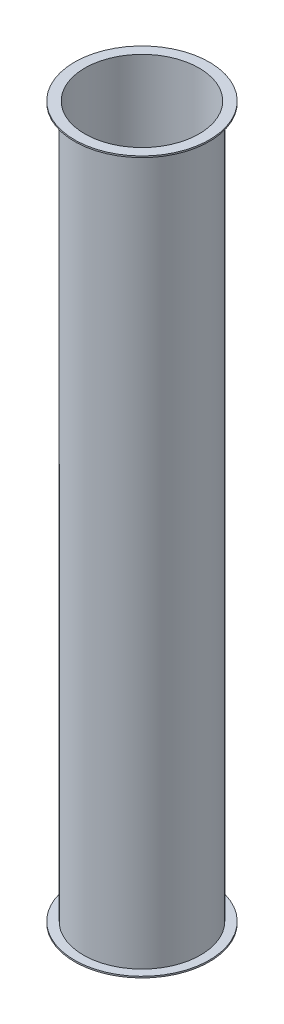
ISO-10303-21;
HEADER;
FILE_DESCRIPTION(('STEP AP214'),'2;1');
FILE_NAME('part.step','',(''),(''),'','','');
FILE_SCHEMA(('AUTOMOTIVE_DESIGN { 1 0 10303 214 1 1 1 1 }'));
ENDSEC;
DATA;
#1=APPLICATION_CONTEXT('core data for automotive mechanical design processes');
#2=APPLICATION_PROTOCOL_DEFINITION('international standard','automotive_design',2000,#1);
#3=PRODUCT_CONTEXT('',#1,'mechanical');
#4=PRODUCT('Part','Part','',(#3));
#5=PRODUCT_RELATED_PRODUCT_CATEGORY('part','',(#4));
#6=PRODUCT_DEFINITION_FORMATION('','',#4);
#7=PRODUCT_DEFINITION_CONTEXT('part definition',#1,'design');
#8=PRODUCT_DEFINITION('design','',#6,#7);
#9=PRODUCT_DEFINITION_SHAPE('','',#8);
#10=(LENGTH_UNIT() NAMED_UNIT(*) SI_UNIT(.MILLI.,.METRE.));
#11=(NAMED_UNIT(*) PLANE_ANGLE_UNIT() SI_UNIT($,.RADIAN.));
#12=(NAMED_UNIT(*) SI_UNIT($,.STERADIAN.) SOLID_ANGLE_UNIT());
#13=UNCERTAINTY_MEASURE_WITH_UNIT(LENGTH_MEASURE(1.E-05),#10,'distance_accuracy_value','');
#14=(GEOMETRIC_REPRESENTATION_CONTEXT(3) GLOBAL_UNCERTAINTY_ASSIGNED_CONTEXT((#13)) GLOBAL_UNIT_ASSIGNED_CONTEXT((#10,
#11,#12)) REPRESENTATION_CONTEXT('',''));
#15=CARTESIAN_POINT('',(0.,0.,0.));
#16=DIRECTION('',(0.,0.,1.));
#17=DIRECTION('',(1.,0.,0.));
#18=AXIS2_PLACEMENT_3D('',#15,#16,#17);
#19=CARTESIAN_POINT('',(-42.5,486.,0.));
#20=DIRECTION('',(0.,1.,0.));
#21=DIRECTION('',(1.,0.,0.));
#22=AXIS2_PLACEMENT_3D('',#19,#20,#21);
#23=PLANE('',#22);
#24=CARTESIAN_POINT('',(0.,486.,0.));
#25=DIRECTION('',(0.,1.,0.));
#26=DIRECTION('',(-1.,0.,0.));
#27=AXIS2_PLACEMENT_3D('',#24,#25,#26);
#28=CIRCLE('',#27,39.);
#29=CARTESIAN_POINT('',(-39.,486.,0.));
#30=VERTEX_POINT('',#29);
#31=EDGE_CURVE('E79',#30,#30,#28,.T.);
#32=ORIENTED_EDGE('',*,*,#31,.F.);
#33=EDGE_LOOP('',(#32));
#34=FACE_BOUND('',#33,.T.);
#35=CARTESIAN_POINT('',(0.,486.,0.));
#36=DIRECTION('',(0.,1.,0.));
#37=DIRECTION('',(-1.,0.,0.));
#38=AXIS2_PLACEMENT_3D('',#35,#36,#37);
#39=CIRCLE('',#38,46.);
#40=CARTESIAN_POINT('',(-46.,486.,0.));
#41=VERTEX_POINT('',#40);
#42=EDGE_CURVE('E11',#41,#41,#39,.T.);
#43=ORIENTED_EDGE('',*,*,#42,.T.);
#44=EDGE_LOOP('',(#43));
#45=FACE_BOUND('',#44,.T.);
#46=ADVANCED_FACE('F19',(#34,#45),#23,.T.);
#47=CARTESIAN_POINT('',(0.,485.5,0.));
#48=DIRECTION('',(0.,1.,0.));
#49=DIRECTION('',(-1.,0.,0.));
#50=AXIS2_PLACEMENT_3D('',#47,#48,#49);
#51=CYLINDRICAL_SURFACE('',#50,46.);
#52=CARTESIAN_POINT('',(0.,485.,0.));
#53=DIRECTION('',(0.,1.,0.));
#54=DIRECTION('',(-1.,0.,0.));
#55=AXIS2_PLACEMENT_3D('',#52,#53,#54);
#56=CIRCLE('',#55,46.);
#57=CARTESIAN_POINT('',(-46.,485.,0.));
#58=VERTEX_POINT('',#57);
#59=EDGE_CURVE('E29',#58,#58,#56,.T.);
#60=ORIENTED_EDGE('',*,*,#59,.T.);
#61=EDGE_LOOP('',(#60));
#62=FACE_BOUND('',#61,.T.);
#63=ORIENTED_EDGE('',*,*,#42,.F.);
#64=EDGE_LOOP('',(#63));
#65=FACE_BOUND('',#64,.T.);
#66=ADVANCED_FACE('F114',(#62,#65),#51,.T.);
#67=CARTESIAN_POINT('',(-43.,485.,0.));
#68=DIRECTION('',(0.,-1.,0.));
#69=DIRECTION('',(0.,0.,-1.));
#70=AXIS2_PLACEMENT_3D('',#67,#68,#69);
#71=PLANE('',#70);
#72=CARTESIAN_POINT('',(0.,485.,0.));
#73=DIRECTION('',(0.,1.,0.));
#74=DIRECTION('',(-1.,0.,0.));
#75=AXIS2_PLACEMENT_3D('',#72,#73,#74);
#76=CIRCLE('',#75,40.);
#77=CARTESIAN_POINT('',(-40.,485.,0.));
#78=VERTEX_POINT('',#77);
#79=EDGE_CURVE('E70',#78,#78,#76,.T.);
#80=ORIENTED_EDGE('',*,*,#79,.T.);
#81=EDGE_LOOP('',(#80));
#82=FACE_BOUND('',#81,.T.);
#83=ORIENTED_EDGE('',*,*,#59,.F.);
#84=EDGE_LOOP('',(#83));
#85=FACE_BOUND('',#84,.T.);
#86=ADVANCED_FACE('F119',(#82,#85),#71,.T.);
#87=CARTESIAN_POINT('',(0.,243.,0.));
#88=DIRECTION('',(0.,1.,0.));
#89=DIRECTION('',(-1.,0.,0.));
#90=AXIS2_PLACEMENT_3D('',#87,#88,#89);
#91=CYLINDRICAL_SURFACE('',#90,40.);
#92=CARTESIAN_POINT('',(0.,0.999999999999943,0.));
#93=DIRECTION('',(0.,1.,0.));
#94=DIRECTION('',(-1.,0.,0.));
#95=AXIS2_PLACEMENT_3D('',#92,#93,#94);
#96=CIRCLE('',#95,40.);
#97=CARTESIAN_POINT('',(-40.,0.999999999999941,0.));
#98=VERTEX_POINT('',#97);
#99=EDGE_CURVE('E65',#98,#98,#96,.T.);
#100=ORIENTED_EDGE('',*,*,#99,.T.);
#101=EDGE_LOOP('',(#100));
#102=FACE_BOUND('',#101,.T.);
#103=ORIENTED_EDGE('',*,*,#79,.F.);
#104=EDGE_LOOP('',(#103));
#105=FACE_BOUND('',#104,.T.);
#106=ADVANCED_FACE('F66',(#102,#105),#91,.T.);
#107=CARTESIAN_POINT('',(-43.,0.99999999999994,0.));
#108=DIRECTION('',(0.,1.,0.));
#109=DIRECTION('',(1.,0.,0.));
#110=AXIS2_PLACEMENT_3D('',#107,#108,#109);
#111=PLANE('',#110);
#112=ORIENTED_EDGE('',*,*,#99,.F.);
#113=EDGE_LOOP('',(#112));
#114=FACE_BOUND('',#113,.T.);
#115=CARTESIAN_POINT('',(0.,0.999999999999943,0.));
#116=DIRECTION('',(0.,1.,0.));
#117=DIRECTION('',(-1.,0.,0.));
#118=AXIS2_PLACEMENT_3D('',#115,#116,#117);
#119=CIRCLE('',#118,46.);
#120=CARTESIAN_POINT('',(-46.,0.99999999999994,0.));
#121=VERTEX_POINT('',#120);
#122=EDGE_CURVE('E71',#121,#121,#119,.T.);
#123=ORIENTED_EDGE('',*,*,#122,.T.);
#124=EDGE_LOOP('',(#123));
#125=FACE_BOUND('',#124,.T.);
#126=ADVANCED_FACE('F110',(#114,#125),#111,.T.);
#127=CARTESIAN_POINT('',(0.,0.499999999999972,0.));
#128=DIRECTION('',(0.,1.,0.));
#129=DIRECTION('',(-1.,0.,0.));
#130=AXIS2_PLACEMENT_3D('',#127,#128,#129);
#131=CYLINDRICAL_SURFACE('',#130,46.);
#132=CARTESIAN_POINT('',(0.,0.,0.));
#133=DIRECTION('',(0.,1.,0.));
#134=DIRECTION('',(-1.,0.,0.));
#135=AXIS2_PLACEMENT_3D('',#132,#133,#134);
#136=CIRCLE('',#135,46.);
#137=CARTESIAN_POINT('',(-46.,0.,0.));
#138=VERTEX_POINT('',#137);
#139=EDGE_CURVE('E22',#138,#138,#136,.T.);
#140=ORIENTED_EDGE('',*,*,#139,.T.);
#141=EDGE_LOOP('',(#140));
#142=FACE_BOUND('',#141,.T.);
#143=ORIENTED_EDGE('',*,*,#122,.F.);
#144=EDGE_LOOP('',(#143));
#145=FACE_BOUND('',#144,.T.);
#146=ADVANCED_FACE('F97',(#142,#145),#131,.T.);
#147=CARTESIAN_POINT('',(-42.5,0.,0.));
#148=DIRECTION('',(0.,-1.,0.));
#149=DIRECTION('',(0.,0.,-1.));
#150=AXIS2_PLACEMENT_3D('',#147,#148,#149);
#151=PLANE('',#150);
#152=CARTESIAN_POINT('',(0.,0.,0.));
#153=DIRECTION('',(0.,1.,0.));
#154=DIRECTION('',(-1.,0.,0.));
#155=AXIS2_PLACEMENT_3D('',#152,#153,#154);
#156=CIRCLE('',#155,39.);
#157=CARTESIAN_POINT('',(-39.,0.,0.));
#158=VERTEX_POINT('',#157);
#159=EDGE_CURVE('E83',#158,#158,#156,.T.);
#160=ORIENTED_EDGE('',*,*,#159,.T.);
#161=EDGE_LOOP('',(#160));
#162=FACE_BOUND('',#161,.T.);
#163=ORIENTED_EDGE('',*,*,#139,.F.);
#164=EDGE_LOOP('',(#163));
#165=FACE_BOUND('',#164,.T.);
#166=ADVANCED_FACE('F100',(#162,#165),#151,.T.);
#167=CARTESIAN_POINT('',(0.,243.,0.));
#168=DIRECTION('',(0.,1.,0.));
#169=DIRECTION('',(-1.,0.,0.));
#170=AXIS2_PLACEMENT_3D('',#167,#168,#169);
#171=CYLINDRICAL_SURFACE('',#170,39.);
#172=ORIENTED_EDGE('',*,*,#31,.T.);
#173=EDGE_LOOP('',(#172));
#174=FACE_BOUND('',#173,.T.);
#175=ORIENTED_EDGE('',*,*,#159,.F.);
#176=EDGE_LOOP('',(#175));
#177=FACE_BOUND('',#176,.T.);
#178=ADVANCED_FACE('F102',(#174,#177),#171,.F.);
#179=CLOSED_SHELL('',(#46,#66,#86,#106,#126,#146,#166,#178));
#180=MANIFOLD_SOLID_BREP('B1',#179);
#181=ADVANCED_BREP_SHAPE_REPRESENTATION('',(#18,#180),#14);
#182=SHAPE_DEFINITION_REPRESENTATION(#9,#181);
ENDSEC;
END-ISO-10303-21;
